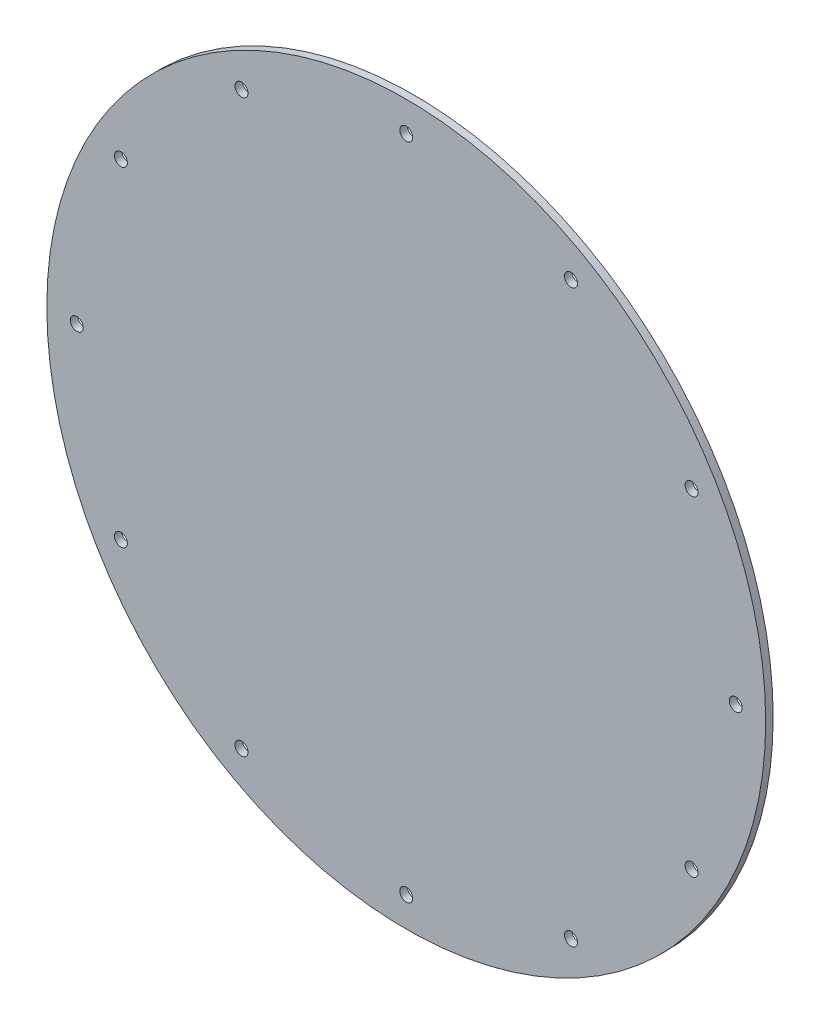
ISO-10303-21;
HEADER;
FILE_DESCRIPTION(('STEP AP214'),'2;1');
FILE_NAME('part.step','',(''),(''),'','','');
FILE_SCHEMA(('AUTOMOTIVE_DESIGN { 1 0 10303 214 1 1 1 1 }'));
ENDSEC;
DATA;
#1=APPLICATION_CONTEXT('core data for automotive mechanical design processes');
#2=APPLICATION_PROTOCOL_DEFINITION('international standard','automotive_design',2000,#1);
#3=PRODUCT_CONTEXT('',#1,'mechanical');
#4=PRODUCT('Part','Part','',(#3));
#5=PRODUCT_RELATED_PRODUCT_CATEGORY('part','',(#4));
#6=PRODUCT_DEFINITION_FORMATION('','',#4);
#7=PRODUCT_DEFINITION_CONTEXT('part definition',#1,'design');
#8=PRODUCT_DEFINITION('design','',#6,#7);
#9=PRODUCT_DEFINITION_SHAPE('','',#8);
#10=(LENGTH_UNIT() NAMED_UNIT(*) SI_UNIT(.MILLI.,.METRE.));
#11=(NAMED_UNIT(*) PLANE_ANGLE_UNIT() SI_UNIT($,.RADIAN.));
#12=(NAMED_UNIT(*) SI_UNIT($,.STERADIAN.) SOLID_ANGLE_UNIT());
#13=UNCERTAINTY_MEASURE_WITH_UNIT(LENGTH_MEASURE(1.E-05),#10,'distance_accuracy_value','');
#14=(GEOMETRIC_REPRESENTATION_CONTEXT(3) GLOBAL_UNCERTAINTY_ASSIGNED_CONTEXT((#13)) GLOBAL_UNIT_ASSIGNED_CONTEXT((#10,
#11,#12)) REPRESENTATION_CONTEXT('',''));
#15=CARTESIAN_POINT('',(0.,0.,0.));
#16=DIRECTION('',(0.,0.,1.));
#17=DIRECTION('',(1.,0.,0.));
#18=AXIS2_PLACEMENT_3D('',#15,#16,#17);
#19=CARTESIAN_POINT('',(0.,0.,12.7));
#20=DIRECTION('',(0.,0.,-1.));
#21=DIRECTION('',(-1.,0.,0.));
#22=AXIS2_PLACEMENT_3D('',#19,#20,#21);
#23=CYLINDRICAL_SURFACE('',#22,609.6);
#24=CARTESIAN_POINT('',(0.,0.,12.7));
#25=DIRECTION('',(0.,0.,1.));
#26=DIRECTION('',(1.,0.,0.));
#27=AXIS2_PLACEMENT_3D('',#24,#25,#26);
#28=CIRCLE('',#27,609.6);
#29=CARTESIAN_POINT('',(609.6,0.,12.7));
#30=VERTEX_POINT('',#29);
#31=EDGE_CURVE('E10',#30,#30,#28,.T.);
#32=ORIENTED_EDGE('',*,*,#31,.F.);
#33=EDGE_LOOP('',(#32));
#34=FACE_BOUND('',#33,.T.);
#35=CARTESIAN_POINT('',(0.,0.,0.));
#36=DIRECTION('',(0.,0.,1.));
#37=DIRECTION('',(1.,0.,0.));
#38=AXIS2_PLACEMENT_3D('',#35,#36,#37);
#39=CIRCLE('',#38,609.6);
#40=CARTESIAN_POINT('',(609.6,0.,0.));
#41=VERTEX_POINT('',#40);
#42=EDGE_CURVE('E36',#41,#41,#39,.T.);
#43=ORIENTED_EDGE('',*,*,#42,.T.);
#44=EDGE_LOOP('',(#43));
#45=FACE_BOUND('',#44,.T.);
#46=ADVANCED_FACE('F33',(#34,#45),#23,.T.);
#47=CARTESIAN_POINT('',(0.,0.,12.7));
#48=DIRECTION('',(0.,0.,1.));
#49=DIRECTION('',(1.,0.,0.));
#50=AXIS2_PLACEMENT_3D('',#47,#48,#49);
#51=PLANE('',#50);
#52=CARTESIAN_POINT('',(0.,558.8,12.7));
#53=DIRECTION('',(0.,0.,1.));
#54=DIRECTION('',(1.,0.,0.));
#55=AXIS2_PLACEMENT_3D('',#52,#53,#54);
#56=CIRCLE('',#55,11.);
#57=CARTESIAN_POINT('',(11.,558.8,12.7));
#58=VERTEX_POINT('',#57);
#59=EDGE_CURVE('E43',#58,#58,#56,.T.);
#60=ORIENTED_EDGE('',*,*,#59,.F.);
#61=EDGE_LOOP('',(#60));
#62=FACE_BOUND('',#61,.T.);
#63=CARTESIAN_POINT('',(-279.399999999997,483.934995634732,12.7));
#64=DIRECTION('',(0.,0.,1.));
#65=DIRECTION('',(1.,0.,0.));
#66=AXIS2_PLACEMENT_3D('',#63,#64,#65);
#67=CIRCLE('',#66,11.0000000000136);
#68=CARTESIAN_POINT('',(-268.399999999983,483.934995634732,12.7));
#69=VERTEX_POINT('',#68);
#70=EDGE_CURVE('E95',#69,#69,#67,.T.);
#71=ORIENTED_EDGE('',*,*,#70,.F.);
#72=EDGE_LOOP('',(#71));
#73=FACE_BOUND('',#72,.T.);
#74=CARTESIAN_POINT('',(-483.934995634733,279.399999999979,12.7));
#75=DIRECTION('',(0.,0.,1.));
#76=DIRECTION('',(1.,0.,0.));
#77=AXIS2_PLACEMENT_3D('',#74,#75,#76);
#78=CIRCLE('',#77,11.000000000024);
#79=CARTESIAN_POINT('',(-472.934995634709,279.399999999979,12.7));
#80=VERTEX_POINT('',#79);
#81=EDGE_CURVE('E102',#80,#80,#78,.T.);
#82=ORIENTED_EDGE('',*,*,#81,.F.);
#83=EDGE_LOOP('',(#82));
#84=FACE_BOUND('',#83,.T.);
#85=CARTESIAN_POINT('',(-558.799999999976,-2.38230768445646E-11,12.7));
#86=DIRECTION('',(0.,0.,1.));
#87=DIRECTION('',(1.,0.,0.));
#88=AXIS2_PLACEMENT_3D('',#85,#86,#87);
#89=CIRCLE('',#88,11.0000000000354);
#90=CARTESIAN_POINT('',(-547.799999999941,-2.38230768445646E-11,12.7));
#91=VERTEX_POINT('',#90);
#92=EDGE_CURVE('E78',#91,#91,#89,.T.);
#93=ORIENTED_EDGE('',*,*,#92,.F.);
#94=EDGE_LOOP('',(#93));
#95=FACE_BOUND('',#94,.T.);
#96=CARTESIAN_POINT('',(279.400000000001,483.934995634744,12.7));
#97=DIRECTION('',(0.,0.,1.));
#98=DIRECTION('',(1.,0.,0.));
#99=AXIS2_PLACEMENT_3D('',#96,#97,#98);
#100=CIRCLE('',#99,11.);
#101=CARTESIAN_POINT('',(290.400000000001,483.934995634744,12.7));
#102=VERTEX_POINT('',#101);
#103=EDGE_CURVE('E65',#102,#102,#100,.T.);
#104=ORIENTED_EDGE('',*,*,#103,.F.);
#105=EDGE_LOOP('',(#104));
#106=FACE_BOUND('',#105,.T.);
#107=CARTESIAN_POINT('',(483.934995634756,279.400000000021,12.7));
#108=DIRECTION('',(0.,0.,1.));
#109=DIRECTION('',(1.,0.,0.));
#110=AXIS2_PLACEMENT_3D('',#107,#108,#109);
#111=CIRCLE('',#110,11.0000000000066);
#112=CARTESIAN_POINT('',(494.934995634763,279.400000000021,12.7));
#113=VERTEX_POINT('',#112);
#114=EDGE_CURVE('E59',#113,#113,#111,.T.);
#115=ORIENTED_EDGE('',*,*,#114,.F.);
#116=EDGE_LOOP('',(#115));
#117=FACE_BOUND('',#116,.T.);
#118=CARTESIAN_POINT('',(558.800000000024,2.37546435814283E-11,12.7));
#119=DIRECTION('',(0.,0.,1.));
#120=DIRECTION('',(1.,0.,0.));
#121=AXIS2_PLACEMENT_3D('',#118,#119,#120);
#122=CIRCLE('',#121,11.0000000000176);
#123=CARTESIAN_POINT('',(569.800000000041,2.37546435814283E-11,12.7));
#124=VERTEX_POINT('',#123);
#125=EDGE_CURVE('E53',#124,#124,#122,.T.);
#126=ORIENTED_EDGE('',*,*,#125,.F.);
#127=EDGE_LOOP('',(#126));
#128=FACE_BOUND('',#127,.T.);
#129=CARTESIAN_POINT('',(483.93499563478,-279.399999999979,12.7));
#130=DIRECTION('',(0.,0.,1.));
#131=DIRECTION('',(1.,0.,0.));
#132=AXIS2_PLACEMENT_3D('',#129,#130,#131);
#133=CIRCLE('',#132,11.0000000000306);
#134=CARTESIAN_POINT('',(494.934995634811,-279.399999999979,12.7));
#135=VERTEX_POINT('',#134);
#136=EDGE_CURVE('E45',#135,#135,#133,.T.);
#137=ORIENTED_EDGE('',*,*,#136,.F.);
#138=EDGE_LOOP('',(#137));
#139=FACE_BOUND('',#138,.T.);
#140=CARTESIAN_POINT('',(279.400000000044,-483.934995634732,12.7));
#141=DIRECTION('',(0.,0.,1.));
#142=DIRECTION('',(1.,0.,0.));
#143=AXIS2_PLACEMENT_3D('',#140,#141,#142);
#144=CIRCLE('',#143,11.0000000000423);
#145=CARTESIAN_POINT('',(290.400000000087,-483.934995634732,12.7));
#146=VERTEX_POINT('',#145);
#147=EDGE_CURVE('E52',#146,#146,#144,.T.);
#148=ORIENTED_EDGE('',*,*,#147,.F.);
#149=EDGE_LOOP('',(#148));
#150=FACE_BOUND('',#149,.T.);
#151=CARTESIAN_POINT('',(4.75092871628566E-11,-558.8,12.7));
#152=DIRECTION('',(0.,0.,1.));
#153=DIRECTION('',(1.,0.,0.));
#154=AXIS2_PLACEMENT_3D('',#151,#152,#153);
#155=CIRCLE('',#154,11.0000000000492);
#156=CARTESIAN_POINT('',(11.0000000000967,-558.8,12.7));
#157=VERTEX_POINT('',#156);
#158=EDGE_CURVE('E85',#157,#157,#155,.T.);
#159=ORIENTED_EDGE('',*,*,#158,.F.);
#160=EDGE_LOOP('',(#159));
#161=FACE_BOUND('',#160,.T.);
#162=CARTESIAN_POINT('',(-279.399999999956,-483.934995634756,12.7));
#163=DIRECTION('',(0.,0.,1.));
#164=DIRECTION('',(1.,0.,0.));
#165=AXIS2_PLACEMENT_3D('',#162,#163,#164);
#166=CIRCLE('',#165,11.0000000000504);
#167=CARTESIAN_POINT('',(-268.399999999905,-483.934995634756,12.7));
#168=VERTEX_POINT('',#167);
#169=EDGE_CURVE('E79',#168,#168,#166,.T.);
#170=ORIENTED_EDGE('',*,*,#169,.F.);
#171=EDGE_LOOP('',(#170));
#172=FACE_BOUND('',#171,.T.);
#173=CARTESIAN_POINT('',(-483.934995634709,-279.400000000021,12.7));
#174=DIRECTION('',(0.,0.,1.));
#175=DIRECTION('',(1.,0.,0.));
#176=AXIS2_PLACEMENT_3D('',#173,#174,#175);
#177=CIRCLE('',#176,11.0000000000452);
#178=CARTESIAN_POINT('',(-472.934995634663,-279.400000000021,12.7));
#179=VERTEX_POINT('',#178);
#180=EDGE_CURVE('E71',#179,#179,#177,.T.);
#181=ORIENTED_EDGE('',*,*,#180,.F.);
#182=EDGE_LOOP('',(#181));
#183=FACE_BOUND('',#182,.T.);
#184=ORIENTED_EDGE('',*,*,#31,.T.);
#185=EDGE_LOOP('',(#184));
#186=FACE_BOUND('',#185,.T.);
#187=ADVANCED_FACE('F127',(#62,#73,#84,#95,#106,#117,#128,#139,#150,#161,#172,#183,#186),#51,.T.);
#188=CARTESIAN_POINT('',(0.,0.,0.));
#189=DIRECTION('',(0.,0.,1.));
#190=DIRECTION('',(1.,0.,0.));
#191=AXIS2_PLACEMENT_3D('',#188,#189,#190);
#192=PLANE('',#191);
#193=CARTESIAN_POINT('',(0.,558.8,0.));
#194=DIRECTION('',(0.,0.,1.));
#195=DIRECTION('',(1.,0.,0.));
#196=AXIS2_PLACEMENT_3D('',#193,#194,#195);
#197=CIRCLE('',#196,11.);
#198=CARTESIAN_POINT('',(11.,558.8,0.));
#199=VERTEX_POINT('',#198);
#200=EDGE_CURVE('E68',#199,#199,#197,.T.);
#201=ORIENTED_EDGE('',*,*,#200,.T.);
#202=EDGE_LOOP('',(#201));
#203=FACE_BOUND('',#202,.T.);
#204=CARTESIAN_POINT('',(-279.399999999997,483.934995634732,0.));
#205=DIRECTION('',(0.,0.,1.));
#206=DIRECTION('',(1.,0.,0.));
#207=AXIS2_PLACEMENT_3D('',#204,#205,#206);
#208=CIRCLE('',#207,11.0000000000136);
#209=CARTESIAN_POINT('',(-268.399999999983,483.934995634732,0.));
#210=VERTEX_POINT('',#209);
#211=EDGE_CURVE('E99',#210,#210,#208,.T.);
#212=ORIENTED_EDGE('',*,*,#211,.T.);
#213=EDGE_LOOP('',(#212));
#214=FACE_BOUND('',#213,.T.);
#215=CARTESIAN_POINT('',(-483.934995634733,279.399999999979,0.));
#216=DIRECTION('',(0.,0.,1.));
#217=DIRECTION('',(1.,0.,0.));
#218=AXIS2_PLACEMENT_3D('',#215,#216,#217);
#219=CIRCLE('',#218,11.000000000024);
#220=CARTESIAN_POINT('',(-472.934995634709,279.399999999979,0.));
#221=VERTEX_POINT('',#220);
#222=EDGE_CURVE('E98',#221,#221,#219,.T.);
#223=ORIENTED_EDGE('',*,*,#222,.T.);
#224=EDGE_LOOP('',(#223));
#225=FACE_BOUND('',#224,.T.);
#226=CARTESIAN_POINT('',(-558.799999999976,-2.38230768445646E-11,0.));
#227=DIRECTION('',(0.,0.,1.));
#228=DIRECTION('',(1.,0.,0.));
#229=AXIS2_PLACEMENT_3D('',#226,#227,#228);
#230=CIRCLE('',#229,11.0000000000354);
#231=CARTESIAN_POINT('',(-547.799999999941,-2.38230768445646E-11,0.));
#232=VERTEX_POINT('',#231);
#233=EDGE_CURVE('E105',#232,#232,#230,.T.);
#234=ORIENTED_EDGE('',*,*,#233,.T.);
#235=EDGE_LOOP('',(#234));
#236=FACE_BOUND('',#235,.T.);
#237=CARTESIAN_POINT('',(279.400000000001,483.934995634744,0.));
#238=DIRECTION('',(0.,0.,1.));
#239=DIRECTION('',(1.,0.,0.));
#240=AXIS2_PLACEMENT_3D('',#237,#238,#239);
#241=CIRCLE('',#240,11.);
#242=CARTESIAN_POINT('',(290.400000000001,483.934995634744,0.));
#243=VERTEX_POINT('',#242);
#244=EDGE_CURVE('E62',#243,#243,#241,.T.);
#245=ORIENTED_EDGE('',*,*,#244,.T.);
#246=EDGE_LOOP('',(#245));
#247=FACE_BOUND('',#246,.T.);
#248=CARTESIAN_POINT('',(483.934995634756,279.400000000021,0.));
#249=DIRECTION('',(0.,0.,1.));
#250=DIRECTION('',(1.,0.,0.));
#251=AXIS2_PLACEMENT_3D('',#248,#249,#250);
#252=CIRCLE('',#251,11.0000000000066);
#253=CARTESIAN_POINT('',(494.934995634763,279.400000000021,0.));
#254=VERTEX_POINT('',#253);
#255=EDGE_CURVE('E56',#254,#254,#252,.T.);
#256=ORIENTED_EDGE('',*,*,#255,.T.);
#257=EDGE_LOOP('',(#256));
#258=FACE_BOUND('',#257,.T.);
#259=CARTESIAN_POINT('',(558.800000000024,2.37546435814283E-11,0.));
#260=DIRECTION('',(0.,0.,1.));
#261=DIRECTION('',(1.,0.,0.));
#262=AXIS2_PLACEMENT_3D('',#259,#260,#261);
#263=CIRCLE('',#262,11.0000000000176);
#264=CARTESIAN_POINT('',(569.800000000041,2.37546435814283E-11,0.));
#265=VERTEX_POINT('',#264);
#266=EDGE_CURVE('E48',#265,#265,#263,.T.);
#267=ORIENTED_EDGE('',*,*,#266,.T.);
#268=EDGE_LOOP('',(#267));
#269=FACE_BOUND('',#268,.T.);
#270=CARTESIAN_POINT('',(483.93499563478,-279.399999999979,0.));
#271=DIRECTION('',(0.,0.,1.));
#272=DIRECTION('',(1.,0.,0.));
#273=AXIS2_PLACEMENT_3D('',#270,#271,#272);
#274=CIRCLE('',#273,11.0000000000306);
#275=CARTESIAN_POINT('',(494.934995634811,-279.399999999979,0.));
#276=VERTEX_POINT('',#275);
#277=EDGE_CURVE('E49',#276,#276,#274,.T.);
#278=ORIENTED_EDGE('',*,*,#277,.T.);
#279=EDGE_LOOP('',(#278));
#280=FACE_BOUND('',#279,.T.);
#281=CARTESIAN_POINT('',(279.400000000044,-483.934995634732,0.));
#282=DIRECTION('',(0.,0.,1.));
#283=DIRECTION('',(1.,0.,0.));
#284=AXIS2_PLACEMENT_3D('',#281,#282,#283);
#285=CIRCLE('',#284,11.0000000000423);
#286=CARTESIAN_POINT('',(290.400000000087,-483.934995634732,0.));
#287=VERTEX_POINT('',#286);
#288=EDGE_CURVE('E88',#287,#287,#285,.T.);
#289=ORIENTED_EDGE('',*,*,#288,.T.);
#290=EDGE_LOOP('',(#289));
#291=FACE_BOUND('',#290,.T.);
#292=CARTESIAN_POINT('',(4.75092871628566E-11,-558.8,0.));
#293=DIRECTION('',(0.,0.,1.));
#294=DIRECTION('',(1.,0.,0.));
#295=AXIS2_PLACEMENT_3D('',#292,#293,#294);
#296=CIRCLE('',#295,11.0000000000492);
#297=CARTESIAN_POINT('',(11.0000000000967,-558.8,0.));
#298=VERTEX_POINT('',#297);
#299=EDGE_CURVE('E82',#298,#298,#296,.T.);
#300=ORIENTED_EDGE('',*,*,#299,.T.);
#301=EDGE_LOOP('',(#300));
#302=FACE_BOUND('',#301,.T.);
#303=CARTESIAN_POINT('',(-279.399999999956,-483.934995634756,0.));
#304=DIRECTION('',(0.,0.,1.));
#305=DIRECTION('',(1.,0.,0.));
#306=AXIS2_PLACEMENT_3D('',#303,#304,#305);
#307=CIRCLE('',#306,11.0000000000504);
#308=CARTESIAN_POINT('',(-268.399999999905,-483.934995634756,0.));
#309=VERTEX_POINT('',#308);
#310=EDGE_CURVE('E74',#309,#309,#307,.T.);
#311=ORIENTED_EDGE('',*,*,#310,.T.);
#312=EDGE_LOOP('',(#311));
#313=FACE_BOUND('',#312,.T.);
#314=CARTESIAN_POINT('',(-483.934995634709,-279.400000000021,0.));
#315=DIRECTION('',(0.,0.,1.));
#316=DIRECTION('',(1.,0.,0.));
#317=AXIS2_PLACEMENT_3D('',#314,#315,#316);
#318=CIRCLE('',#317,11.0000000000452);
#319=CARTESIAN_POINT('',(-472.934995634663,-279.400000000021,0.));
#320=VERTEX_POINT('',#319);
#321=EDGE_CURVE('E75',#320,#320,#318,.T.);
#322=ORIENTED_EDGE('',*,*,#321,.T.);
#323=EDGE_LOOP('',(#322));
#324=FACE_BOUND('',#323,.T.);
#325=ORIENTED_EDGE('',*,*,#42,.F.);
#326=EDGE_LOOP('',(#325));
#327=FACE_BOUND('',#326,.T.);
#328=ADVANCED_FACE('F117',(#203,#214,#225,#236,#247,#258,#269,#280,#291,#302,#313,#324,#327),
#192,.F.);
#329=CARTESIAN_POINT('',(-483.934995634709,-279.400000000021,43.8126983723505));
#330=DIRECTION('',(0.,0.,-1.));
#331=DIRECTION('',(-1.,0.,0.));
#332=AXIS2_PLACEMENT_3D('',#329,#330,#331);
#333=CYLINDRICAL_SURFACE('',#332,11.0000000000452);
#334=ORIENTED_EDGE('',*,*,#321,.F.);
#335=EDGE_LOOP('',(#334));
#336=FACE_BOUND('',#335,.T.);
#337=ORIENTED_EDGE('',*,*,#180,.T.);
#338=EDGE_LOOP('',(#337));
#339=FACE_BOUND('',#338,.T.);
#340=ADVANCED_FACE('F153',(#336,#339),#333,.F.);
#341=CARTESIAN_POINT('',(-279.399999999956,-483.934995634756,43.8126983723505));
#342=DIRECTION('',(0.,0.,-1.));
#343=DIRECTION('',(-1.,0.,0.));
#344=AXIS2_PLACEMENT_3D('',#341,#342,#343);
#345=CYLINDRICAL_SURFACE('',#344,11.0000000000504);
#346=ORIENTED_EDGE('',*,*,#310,.F.);
#347=EDGE_LOOP('',(#346));
#348=FACE_BOUND('',#347,.T.);
#349=ORIENTED_EDGE('',*,*,#169,.T.);
#350=EDGE_LOOP('',(#349));
#351=FACE_BOUND('',#350,.T.);
#352=ADVANCED_FACE('F155',(#348,#351),#345,.F.);
#353=CARTESIAN_POINT('',(4.75092871628566E-11,-558.8,43.8126983723505));
#354=DIRECTION('',(0.,0.,-1.));
#355=DIRECTION('',(-1.,0.,0.));
#356=AXIS2_PLACEMENT_3D('',#353,#354,#355);
#357=CYLINDRICAL_SURFACE('',#356,11.0000000000492);
#358=ORIENTED_EDGE('',*,*,#299,.F.);
#359=EDGE_LOOP('',(#358));
#360=FACE_BOUND('',#359,.T.);
#361=ORIENTED_EDGE('',*,*,#158,.T.);
#362=EDGE_LOOP('',(#361));
#363=FACE_BOUND('',#362,.T.);
#364=ADVANCED_FACE('F162',(#360,#363),#357,.F.);
#365=CARTESIAN_POINT('',(279.400000000044,-483.934995634732,43.8126983723505));
#366=DIRECTION('',(0.,0.,-1.));
#367=DIRECTION('',(-1.,0.,0.));
#368=AXIS2_PLACEMENT_3D('',#365,#366,#367);
#369=CYLINDRICAL_SURFACE('',#368,11.0000000000423);
#370=ORIENTED_EDGE('',*,*,#288,.F.);
#371=EDGE_LOOP('',(#370));
#372=FACE_BOUND('',#371,.T.);
#373=ORIENTED_EDGE('',*,*,#147,.T.);
#374=EDGE_LOOP('',(#373));
#375=FACE_BOUND('',#374,.T.);
#376=ADVANCED_FACE('F201',(#372,#375),#369,.F.);
#377=CARTESIAN_POINT('',(483.93499563478,-279.399999999979,43.8126983723505));
#378=DIRECTION('',(0.,0.,-1.));
#379=DIRECTION('',(-1.,0.,0.));
#380=AXIS2_PLACEMENT_3D('',#377,#378,#379);
#381=CYLINDRICAL_SURFACE('',#380,11.0000000000306);
#382=ORIENTED_EDGE('',*,*,#277,.F.);
#383=EDGE_LOOP('',(#382));
#384=FACE_BOUND('',#383,.T.);
#385=ORIENTED_EDGE('',*,*,#136,.T.);
#386=EDGE_LOOP('',(#385));
#387=FACE_BOUND('',#386,.T.);
#388=ADVANCED_FACE('F211',(#384,#387),#381,.F.);
#389=CARTESIAN_POINT('',(558.800000000024,2.37546435814283E-11,43.8126983723505));
#390=DIRECTION('',(0.,0.,-1.));
#391=DIRECTION('',(-1.,0.,0.));
#392=AXIS2_PLACEMENT_3D('',#389,#390,#391);
#393=CYLINDRICAL_SURFACE('',#392,11.0000000000176);
#394=ORIENTED_EDGE('',*,*,#266,.F.);
#395=EDGE_LOOP('',(#394));
#396=FACE_BOUND('',#395,.T.);
#397=ORIENTED_EDGE('',*,*,#125,.T.);
#398=EDGE_LOOP('',(#397));
#399=FACE_BOUND('',#398,.T.);
#400=ADVANCED_FACE('F221',(#396,#399),#393,.F.);
#401=CARTESIAN_POINT('',(483.934995634756,279.400000000021,43.8126983723505));
#402=DIRECTION('',(0.,0.,-1.));
#403=DIRECTION('',(-1.,0.,0.));
#404=AXIS2_PLACEMENT_3D('',#401,#402,#403);
#405=CYLINDRICAL_SURFACE('',#404,11.0000000000066);
#406=ORIENTED_EDGE('',*,*,#255,.F.);
#407=EDGE_LOOP('',(#406));
#408=FACE_BOUND('',#407,.T.);
#409=ORIENTED_EDGE('',*,*,#114,.T.);
#410=EDGE_LOOP('',(#409));
#411=FACE_BOUND('',#410,.T.);
#412=ADVANCED_FACE('F231',(#408,#411),#405,.F.);
#413=CARTESIAN_POINT('',(279.400000000001,483.934995634744,43.8126983723505));
#414=DIRECTION('',(0.,0.,-1.));
#415=DIRECTION('',(-1.,0.,0.));
#416=AXIS2_PLACEMENT_3D('',#413,#414,#415);
#417=CYLINDRICAL_SURFACE('',#416,11.);
#418=ORIENTED_EDGE('',*,*,#244,.F.);
#419=EDGE_LOOP('',(#418));
#420=FACE_BOUND('',#419,.T.);
#421=ORIENTED_EDGE('',*,*,#103,.T.);
#422=EDGE_LOOP('',(#421));
#423=FACE_BOUND('',#422,.T.);
#424=ADVANCED_FACE('F241',(#420,#423),#417,.F.);
#425=CARTESIAN_POINT('',(-558.799999999976,-2.38230768445646E-11,43.8126983723505));
#426=DIRECTION('',(0.,0.,-1.));
#427=DIRECTION('',(-1.,0.,0.));
#428=AXIS2_PLACEMENT_3D('',#425,#426,#427);
#429=CYLINDRICAL_SURFACE('',#428,11.0000000000354);
#430=ORIENTED_EDGE('',*,*,#233,.F.);
#431=EDGE_LOOP('',(#430));
#432=FACE_BOUND('',#431,.T.);
#433=ORIENTED_EDGE('',*,*,#92,.T.);
#434=EDGE_LOOP('',(#433));
#435=FACE_BOUND('',#434,.T.);
#436=ADVANCED_FACE('F251',(#432,#435),#429,.F.);
#437=CARTESIAN_POINT('',(-483.934995634733,279.399999999979,43.8126983723505));
#438=DIRECTION('',(0.,0.,-1.));
#439=DIRECTION('',(-1.,0.,0.));
#440=AXIS2_PLACEMENT_3D('',#437,#438,#439);
#441=CYLINDRICAL_SURFACE('',#440,11.000000000024);
#442=ORIENTED_EDGE('',*,*,#222,.F.);
#443=EDGE_LOOP('',(#442));
#444=FACE_BOUND('',#443,.T.);
#445=ORIENTED_EDGE('',*,*,#81,.T.);
#446=EDGE_LOOP('',(#445));
#447=FACE_BOUND('',#446,.T.);
#448=ADVANCED_FACE('F260',(#444,#447),#441,.F.);
#449=CARTESIAN_POINT('',(-279.399999999997,483.934995634732,43.8126983723505));
#450=DIRECTION('',(0.,0.,-1.));
#451=DIRECTION('',(-1.,0.,0.));
#452=AXIS2_PLACEMENT_3D('',#449,#450,#451);
#453=CYLINDRICAL_SURFACE('',#452,11.0000000000136);
#454=ORIENTED_EDGE('',*,*,#211,.F.);
#455=EDGE_LOOP('',(#454));
#456=FACE_BOUND('',#455,.T.);
#457=ORIENTED_EDGE('',*,*,#70,.T.);
#458=EDGE_LOOP('',(#457));
#459=FACE_BOUND('',#458,.T.);
#460=ADVANCED_FACE('F123',(#456,#459),#453,.F.);
#461=CARTESIAN_POINT('',(0.,558.8,43.8126983723505));
#462=DIRECTION('',(0.,0.,-1.));
#463=DIRECTION('',(-1.,0.,0.));
#464=AXIS2_PLACEMENT_3D('',#461,#462,#463);
#465=CYLINDRICAL_SURFACE('',#464,11.);
#466=ORIENTED_EDGE('',*,*,#200,.F.);
#467=EDGE_LOOP('',(#466));
#468=FACE_BOUND('',#467,.T.);
#469=ORIENTED_EDGE('',*,*,#59,.T.);
#470=EDGE_LOOP('',(#469));
#471=FACE_BOUND('',#470,.T.);
#472=ADVANCED_FACE('F120',(#468,#471),#465,.F.);
#473=CLOSED_SHELL('',(#46,#187,#328,#340,#352,#364,#376,#388,#400,#412,#424,#436,#448,#460,#472));
#474=MANIFOLD_SOLID_BREP('B2',#473);
#475=ADVANCED_BREP_SHAPE_REPRESENTATION('',(#18,#474),#14);
#476=SHAPE_DEFINITION_REPRESENTATION(#9,#475);
ENDSEC;
END-ISO-10303-21;
